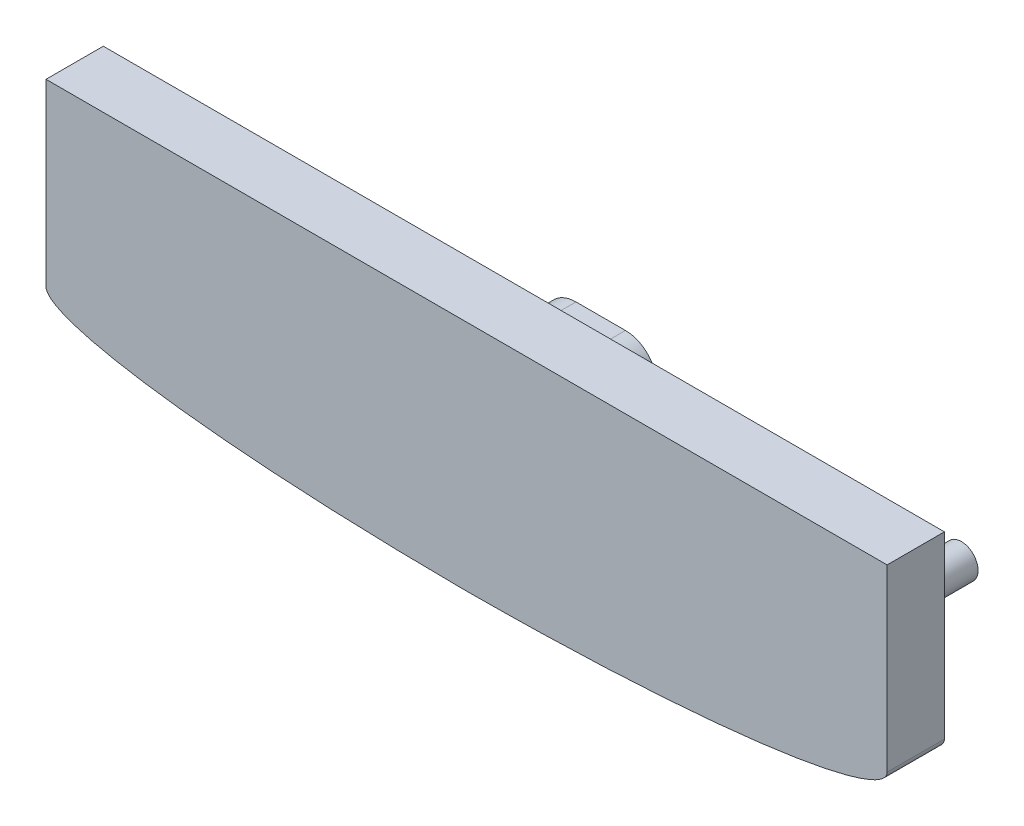
ISO-10303-21;
HEADER;
FILE_DESCRIPTION(('STEP AP214'),'2;1');
FILE_NAME('part.step','',(''),(''),'','','');
FILE_SCHEMA(('AUTOMOTIVE_DESIGN { 1 0 10303 214 1 1 1 1 }'));
ENDSEC;
DATA;
#1=APPLICATION_CONTEXT('core data for automotive mechanical design processes');
#2=APPLICATION_PROTOCOL_DEFINITION('international standard','automotive_design',2000,#1);
#3=PRODUCT_CONTEXT('',#1,'mechanical');
#4=PRODUCT('Part','Part','',(#3));
#5=PRODUCT_RELATED_PRODUCT_CATEGORY('part','',(#4));
#6=PRODUCT_DEFINITION_FORMATION('','',#4);
#7=PRODUCT_DEFINITION_CONTEXT('part definition',#1,'design');
#8=PRODUCT_DEFINITION('design','',#6,#7);
#9=PRODUCT_DEFINITION_SHAPE('','',#8);
#10=(LENGTH_UNIT() NAMED_UNIT(*) SI_UNIT(.MILLI.,.METRE.));
#11=(NAMED_UNIT(*) PLANE_ANGLE_UNIT() SI_UNIT($,.RADIAN.));
#12=(NAMED_UNIT(*) SI_UNIT($,.STERADIAN.) SOLID_ANGLE_UNIT());
#13=UNCERTAINTY_MEASURE_WITH_UNIT(LENGTH_MEASURE(1.E-05),#10,'distance_accuracy_value','');
#14=(GEOMETRIC_REPRESENTATION_CONTEXT(3) GLOBAL_UNCERTAINTY_ASSIGNED_CONTEXT((#13)) GLOBAL_UNIT_ASSIGNED_CONTEXT((#10,
#11,#12)) REPRESENTATION_CONTEXT('',''));
#15=CARTESIAN_POINT('',(0.,0.,0.));
#16=DIRECTION('',(0.,0.,1.));
#17=DIRECTION('',(1.,0.,0.));
#18=AXIS2_PLACEMENT_3D('',#15,#16,#17);
#19=CARTESIAN_POINT('',(0.,0.,-13.6271));
#20=DIRECTION('',(0.,0.,-1.));
#21=DIRECTION('',(-1.,0.,0.));
#22=AXIS2_PLACEMENT_3D('',#19,#20,#21);
#23=PLANE('',#22);
#24=CARTESIAN_POINT('',(85.7631,-22.225,-13.6271));
#25=DIRECTION('',(0.,0.,-1.));
#26=DIRECTION('',(-1.,0.,0.));
#27=AXIS2_PLACEMENT_3D('',#24,#25,#26);
#28=CIRCLE('',#27,3.96874999999999);
#29=CARTESIAN_POINT('',(81.79435,-22.225,-13.6271));
#30=VERTEX_POINT('',#29);
#31=EDGE_CURVE('E390',#30,#30,#28,.T.);
#32=ORIENTED_EDGE('',*,*,#31,.F.);
#33=EDGE_LOOP('',(#32));
#34=FACE_BOUND('',#33,.T.);
#35=CARTESIAN_POINT('',(-85.7631,-22.225,-13.6271));
#36=DIRECTION('',(0.,0.,-1.));
#37=DIRECTION('',(-1.,0.,0.));
#38=AXIS2_PLACEMENT_3D('',#35,#36,#37);
#39=CIRCLE('',#38,3.96874999999999);
#40=CARTESIAN_POINT('',(-89.73185,-22.225,-13.6271));
#41=VERTEX_POINT('',#40);
#42=EDGE_CURVE('E397',#41,#41,#39,.T.);
#43=ORIENTED_EDGE('',*,*,#42,.F.);
#44=EDGE_LOOP('',(#43));
#45=FACE_BOUND('',#44,.T.);
#46=DIRECTION('',(0.,1.,0.));
#47=VECTOR('',#46,1.);
#48=CARTESIAN_POINT('',(100.0125,0.,-13.6271));
#49=LINE('',#48,#47);
#50=CARTESIAN_POINT('',(100.0125,-42.6974,-13.6271));
#51=VERTEX_POINT('',#50);
#52=CARTESIAN_POINT('',(100.0125,0.,-13.6271));
#53=VERTEX_POINT('',#52);
#54=EDGE_CURVE('E164',#51,#53,#49,.T.);
#55=ORIENTED_EDGE('',*,*,#54,.F.);
#56=CARTESIAN_POINT('',(-1.58749999999999,-55.3974,-13.6271));
#57=CARTESIAN_POINT('',(100.0125,-55.3974,-13.6271));
#58=CARTESIAN_POINT('',(100.0125,-42.6974,-13.6271));
#59=(BOUNDED_CURVE() B_SPLINE_CURVE(2,(#56,#57,#58),.UNSPECIFIED.,.F.,
.F.) B_SPLINE_CURVE_WITH_KNOTS((3,3),(0.,1.),
.UNSPECIFIED.) CURVE() GEOMETRIC_REPRESENTATION_ITEM() RATIONAL_B_SPLINE_CURVE((1.,
0.707106781186547,1.)) REPRESENTATION_ITEM(''));
#60=CARTESIAN_POINT('',(1.58735651451836,-55.3942989384919,-13.6271));
#61=VERTEX_POINT('',#60);
#62=EDGE_CURVE('E59',#51,#61,#59,.F.);
#63=ORIENTED_EDGE('',*,*,#62,.T.);
#64=CARTESIAN_POINT('',(-1.58749999999999,-55.3974,-13.6271));
#65=CARTESIAN_POINT('',(100.0125,-55.3974,-13.6271));
#66=CARTESIAN_POINT('',(100.0125,-42.6974,-13.6271));
#67=(BOUNDED_CURVE() B_SPLINE_CURVE(2,(#64,#65,#66),.UNSPECIFIED.,.F.,
.F.) B_SPLINE_CURVE_WITH_KNOTS((3,3),(0.,1.),
.UNSPECIFIED.) CURVE() GEOMETRIC_REPRESENTATION_ITEM() RATIONAL_B_SPLINE_CURVE((1.,
0.707106781186548,1.)) REPRESENTATION_ITEM(''));
#68=CARTESIAN_POINT('',(-1.58744222363934,-55.3974,-13.6271));
#69=VERTEX_POINT('',#68);
#70=EDGE_CURVE('E291',#69,#61,#67,.T.);
#71=ORIENTED_EDGE('',*,*,#70,.F.);
#72=CARTESIAN_POINT('',(-100.0125,-42.6974,-13.6271));
#73=CARTESIAN_POINT('',(-100.0125,-55.3974,-13.6271));
#74=CARTESIAN_POINT('',(1.58750000000002,-55.3974,-13.6271));
#75=(BOUNDED_CURVE() B_SPLINE_CURVE(2,(#72,#73,#74),.UNSPECIFIED.,.F.,
.F.) B_SPLINE_CURVE_WITH_KNOTS((3,3),(0.,1.),
.UNSPECIFIED.) CURVE() GEOMETRIC_REPRESENTATION_ITEM() RATIONAL_B_SPLINE_CURVE((1.,
0.707106781186547,1.)) REPRESENTATION_ITEM(''));
#76=CARTESIAN_POINT('',(-100.0125,-42.6974,-13.6271));
#77=VERTEX_POINT('',#76);
#78=EDGE_CURVE('E66',#69,#77,#75,.F.);
#79=ORIENTED_EDGE('',*,*,#78,.T.);
#80=DIRECTION('',(0.,-1.,0.));
#81=VECTOR('',#80,1.);
#82=CARTESIAN_POINT('',(-100.0125,-55.3974,-13.6271));
#83=LINE('',#82,#81);
#84=CARTESIAN_POINT('',(-100.0125,0.,-13.6271));
#85=VERTEX_POINT('',#84);
#86=EDGE_CURVE('E182',#85,#77,#83,.T.);
#87=ORIENTED_EDGE('',*,*,#86,.F.);
#88=DIRECTION('',(-1.,0.,0.));
#89=VECTOR('',#88,1.);
#90=CARTESIAN_POINT('',(-100.0125,0.,-13.6271));
#91=LINE('',#90,#89);
#92=EDGE_CURVE('E161',#53,#85,#91,.T.);
#93=ORIENTED_EDGE('',*,*,#92,.F.);
#94=EDGE_LOOP('',(#55,#63,#71,#79,#87,#93));
#95=FACE_BOUND('',#94,.T.);
#96=DIRECTION('',(1.,0.,0.));
#97=VECTOR('',#96,1.);
#98=CARTESIAN_POINT('',(5.8801,-14.732,-13.6271));
#99=LINE('',#98,#97);
#100=CARTESIAN_POINT('',(-5.8801,-14.732,-13.6271));
#101=VERTEX_POINT('',#100);
#102=CARTESIAN_POINT('',(5.8801,-14.732,-13.6271));
#103=VERTEX_POINT('',#102);
#104=EDGE_CURVE('E409',#101,#103,#99,.T.);
#105=ORIENTED_EDGE('',*,*,#104,.F.);
#106=CARTESIAN_POINT('',(-5.8801,-22.225,-13.6271));
#107=DIRECTION('',(0.,0.,-1.));
#108=DIRECTION('',(1.,0.,0.));
#109=AXIS2_PLACEMENT_3D('',#106,#107,#108);
#110=CIRCLE('',#109,7.49299999999999);
#111=CARTESIAN_POINT('',(-5.8801,-29.718,-13.6271));
#112=VERTEX_POINT('',#111);
#113=EDGE_CURVE('E149',#112,#101,#110,.T.);
#114=ORIENTED_EDGE('',*,*,#113,.F.);
#115=DIRECTION('',(-1.,0.,0.));
#116=VECTOR('',#115,1.);
#117=CARTESIAN_POINT('',(-5.8801,-29.718,-13.6271));
#118=LINE('',#117,#116);
#119=CARTESIAN_POINT('',(5.8801,-29.718,-13.6271));
#120=VERTEX_POINT('',#119);
#121=EDGE_CURVE('E145',#120,#112,#118,.T.);
#122=ORIENTED_EDGE('',*,*,#121,.F.);
#123=CARTESIAN_POINT('',(5.8801,-22.225,-13.6271));
#124=DIRECTION('',(0.,0.,-1.));
#125=DIRECTION('',(1.,0.,0.));
#126=AXIS2_PLACEMENT_3D('',#123,#124,#125);
#127=CIRCLE('',#126,7.49299999999999);
#128=EDGE_CURVE('E411',#103,#120,#127,.T.);
#129=ORIENTED_EDGE('',*,*,#128,.F.);
#130=EDGE_LOOP('',(#105,#114,#122,#129));
#131=FACE_BOUND('',#130,.T.);
#132=ADVANCED_FACE('F43',(#34,#45,#95,#131),#23,.T.);
#133=CARTESIAN_POINT('',(100.0125,0.,-13.6271));
#134=DIRECTION('',(1.,0.,0.));
#135=DIRECTION('',(0.,1.,0.));
#136=AXIS2_PLACEMENT_3D('',#133,#134,#135);
#137=PLANE('',#136);
#138=DIRECTION('',(0.,1.,0.));
#139=VECTOR('',#138,1.);
#140=CARTESIAN_POINT('',(100.0125,0.,0.));
#141=LINE('',#140,#139);
#142=CARTESIAN_POINT('',(100.0125,-42.6974,0.));
#143=VERTEX_POINT('',#142);
#144=CARTESIAN_POINT('',(100.0125,0.,0.));
#145=VERTEX_POINT('',#144);
#146=EDGE_CURVE('E151',#143,#145,#141,.T.);
#147=ORIENTED_EDGE('',*,*,#146,.F.);
#148=CARTESIAN_POINT('',(100.0125,-42.6974,-14.308455));
#149=CARTESIAN_POINT('',(100.0125,-42.6974,-9.31185166666667));
#150=CARTESIAN_POINT('',(100.0125,-42.6974,-4.31524833333333));
#151=CARTESIAN_POINT('',(100.0125,-42.6974,0.681354999999998));
#152=(BOUNDED_CURVE() B_SPLINE_CURVE(3,(#148,#149,#150,#151),.UNSPECIFIED.,.F.,
.F.) B_SPLINE_CURVE_WITH_KNOTS((4,4),(-0.000681355,0.014308455),
.UNSPECIFIED.) CURVE() GEOMETRIC_REPRESENTATION_ITEM() RATIONAL_B_SPLINE_CURVE((1.,1.,1.,1.)) REPRESENTATION_ITEM(''));
#153=EDGE_CURVE('E176',#143,#51,#152,.F.);
#154=ORIENTED_EDGE('',*,*,#153,.T.);
#155=ORIENTED_EDGE('',*,*,#54,.T.);
#156=DIRECTION('',(0.,0.,1.));
#157=VECTOR('',#156,1.);
#158=CARTESIAN_POINT('',(100.0125,0.,-13.6271));
#159=LINE('',#158,#157);
#160=EDGE_CURVE('E341',#53,#145,#159,.T.);
#161=ORIENTED_EDGE('',*,*,#160,.T.);
#162=EDGE_LOOP('',(#147,#154,#155,#161));
#163=FACE_BOUND('',#162,.T.);
#164=ADVANCED_FACE('F183',(#163),#137,.T.);
#165=CARTESIAN_POINT('',(-100.0125,-55.3974,-13.6271));
#166=DIRECTION('',(-1.,0.,0.));
#167=DIRECTION('',(0.,0.,1.));
#168=AXIS2_PLACEMENT_3D('',#165,#166,#167);
#169=PLANE('',#168);
#170=ORIENTED_EDGE('',*,*,#86,.T.);
#171=CARTESIAN_POINT('',(-100.0125,-42.6974,0.681354999999998));
#172=CARTESIAN_POINT('',(-100.0125,-42.6974,-4.31524833333333));
#173=CARTESIAN_POINT('',(-100.0125,-42.6974,-9.31185166666667));
#174=CARTESIAN_POINT('',(-100.0125,-42.6974,-14.308455));
#175=(BOUNDED_CURVE() B_SPLINE_CURVE(3,(#171,#172,#173,#174),.UNSPECIFIED.,.F.,
.F.) B_SPLINE_CURVE_WITH_KNOTS((4,4),(-0.000681355,0.014308455),
.UNSPECIFIED.) CURVE() GEOMETRIC_REPRESENTATION_ITEM() RATIONAL_B_SPLINE_CURVE((1.,1.,1.,1.)) REPRESENTATION_ITEM(''));
#176=CARTESIAN_POINT('',(-100.0125,-42.6974,0.));
#177=VERTEX_POINT('',#176);
#178=EDGE_CURVE('E12',#77,#177,#175,.F.);
#179=ORIENTED_EDGE('',*,*,#178,.T.);
#180=DIRECTION('',(0.,-1.,0.));
#181=VECTOR('',#180,1.);
#182=CARTESIAN_POINT('',(-100.0125,-55.3974,0.));
#183=LINE('',#182,#181);
#184=CARTESIAN_POINT('',(-100.0125,0.,0.));
#185=VERTEX_POINT('',#184);
#186=EDGE_CURVE('E349',#185,#177,#183,.T.);
#187=ORIENTED_EDGE('',*,*,#186,.F.);
#188=DIRECTION('',(0.,0.,1.));
#189=VECTOR('',#188,1.);
#190=CARTESIAN_POINT('',(-100.0125,0.,-13.6271));
#191=LINE('',#190,#189);
#192=EDGE_CURVE('E338',#85,#185,#191,.T.);
#193=ORIENTED_EDGE('',*,*,#192,.F.);
#194=EDGE_LOOP('',(#170,#179,#187,#193));
#195=FACE_BOUND('',#194,.T.);
#196=ADVANCED_FACE('F192',(#195),#169,.T.);
#197=CARTESIAN_POINT('',(-100.0125,0.,-13.6271));
#198=DIRECTION('',(0.,1.,0.));
#199=DIRECTION('',(-1.,0.,0.));
#200=AXIS2_PLACEMENT_3D('',#197,#198,#199);
#201=PLANE('',#200);
#202=DIRECTION('',(-1.,0.,0.));
#203=VECTOR('',#202,1.);
#204=CARTESIAN_POINT('',(-100.0125,0.,0.));
#205=LINE('',#204,#203);
#206=EDGE_CURVE('E153',#145,#185,#205,.T.);
#207=ORIENTED_EDGE('',*,*,#206,.F.);
#208=ORIENTED_EDGE('',*,*,#160,.F.);
#209=ORIENTED_EDGE('',*,*,#92,.T.);
#210=ORIENTED_EDGE('',*,*,#192,.T.);
#211=EDGE_LOOP('',(#207,#208,#209,#210));
#212=FACE_BOUND('',#211,.T.);
#213=ADVANCED_FACE('F193',(#212),#201,.T.);
#214=CARTESIAN_POINT('',(0.,0.,0.));
#215=DIRECTION('',(0.,0.,-1.));
#216=DIRECTION('',(-1.,0.,0.));
#217=AXIS2_PLACEMENT_3D('',#214,#215,#216);
#218=PLANE('',#217);
#219=CARTESIAN_POINT('',(100.0125,-42.6974,0.));
#220=CARTESIAN_POINT('',(100.0125,-55.3974,0.));
#221=CARTESIAN_POINT('',(-1.58749999999999,-55.3974,0.));
#222=(BOUNDED_CURVE() B_SPLINE_CURVE(2,(#219,#220,#221),.UNSPECIFIED.,.F.,
.F.) B_SPLINE_CURVE_WITH_KNOTS((3,3),(0.,1.),
.UNSPECIFIED.) CURVE() GEOMETRIC_REPRESENTATION_ITEM() RATIONAL_B_SPLINE_CURVE((1.,
0.707106781186547,1.)) REPRESENTATION_ITEM(''));
#223=CARTESIAN_POINT('',(-1.58742861616346,-55.3974,0.));
#224=VERTEX_POINT('',#223);
#225=CARTESIAN_POINT('',(1.58738373006105,-55.3942988853116,0.));
#226=VERTEX_POINT('',#225);
#227=EDGE_CURVE('E167',#224,#226,#222,.F.);
#228=ORIENTED_EDGE('',*,*,#227,.T.);
#229=CARTESIAN_POINT('',(100.0125,-42.6974,0.));
#230=CARTESIAN_POINT('',(100.0125,-55.3974,0.));
#231=CARTESIAN_POINT('',(-1.58749999999999,-55.3974,0.));
#232=(BOUNDED_CURVE() B_SPLINE_CURVE(2,(#229,#230,#231),.UNSPECIFIED.,.F.,
.F.) B_SPLINE_CURVE_WITH_KNOTS((3,3),(0.,1.),
.UNSPECIFIED.) CURVE() GEOMETRIC_REPRESENTATION_ITEM() RATIONAL_B_SPLINE_CURVE((1.,
0.707106781186547,1.)) REPRESENTATION_ITEM(''));
#233=EDGE_CURVE('E366',#226,#143,#232,.F.);
#234=ORIENTED_EDGE('',*,*,#233,.T.);
#235=ORIENTED_EDGE('',*,*,#146,.T.);
#236=ORIENTED_EDGE('',*,*,#206,.T.);
#237=ORIENTED_EDGE('',*,*,#186,.T.);
#238=CARTESIAN_POINT('',(1.58750000000002,-55.3974,0.));
#239=CARTESIAN_POINT('',(-100.0125,-55.3974,0.));
#240=CARTESIAN_POINT('',(-100.0125,-42.6974,0.));
#241=(BOUNDED_CURVE() B_SPLINE_CURVE(2,(#238,#239,#240),.UNSPECIFIED.,.F.,
.F.) B_SPLINE_CURVE_WITH_KNOTS((3,3),(0.,1.),
.UNSPECIFIED.) CURVE() GEOMETRIC_REPRESENTATION_ITEM() RATIONAL_B_SPLINE_CURVE((1.,
0.707106781186547,1.)) REPRESENTATION_ITEM(''));
#242=EDGE_CURVE('E260',#177,#224,#241,.F.);
#243=ORIENTED_EDGE('',*,*,#242,.T.);
#244=EDGE_LOOP('',(#228,#234,#235,#236,#237,#243));
#245=FACE_BOUND('',#244,.T.);
#246=ADVANCED_FACE('F305',(#245),#218,.F.);
#247=CARTESIAN_POINT('',(-5.8801,-22.225,-31.9024));
#248=DIRECTION('',(0.,0.,1.));
#249=DIRECTION('',(1.,0.,0.));
#250=AXIS2_PLACEMENT_3D('',#247,#248,#249);
#251=CYLINDRICAL_SURFACE('',#250,7.49299999999999);
#252=ORIENTED_EDGE('',*,*,#113,.T.);
#253=DIRECTION('',(0.,0.,1.));
#254=VECTOR('',#253,1.);
#255=CARTESIAN_POINT('',(-5.8801,-14.732,-31.9024));
#256=LINE('',#255,#254);
#257=CARTESIAN_POINT('',(-5.8801,-14.732,-31.9024));
#258=VERTEX_POINT('',#257);
#259=EDGE_CURVE('E129',#258,#101,#256,.T.);
#260=ORIENTED_EDGE('',*,*,#259,.F.);
#261=CARTESIAN_POINT('',(-5.8801,-22.225,-31.9024));
#262=DIRECTION('',(0.,0.,-1.));
#263=DIRECTION('',(1.,0.,0.));
#264=AXIS2_PLACEMENT_3D('',#261,#262,#263);
#265=CIRCLE('',#264,7.49299999999999);
#266=CARTESIAN_POINT('',(-5.8801,-29.718,-31.9024));
#267=VERTEX_POINT('',#266);
#268=EDGE_CURVE('E136',#267,#258,#265,.T.);
#269=ORIENTED_EDGE('',*,*,#268,.F.);
#270=DIRECTION('',(0.,0.,1.));
#271=VECTOR('',#270,1.);
#272=CARTESIAN_POINT('',(-5.8801,-29.718,-31.9024));
#273=LINE('',#272,#271);
#274=EDGE_CURVE('E407',#267,#112,#273,.T.);
#275=ORIENTED_EDGE('',*,*,#274,.T.);
#276=EDGE_LOOP('',(#252,#260,#269,#275));
#277=FACE_BOUND('',#276,.T.);
#278=ADVANCED_FACE('F147',(#277),#251,.T.);
#279=CARTESIAN_POINT('',(5.8801,-14.732,-31.9024));
#280=DIRECTION('',(0.,-1.,0.));
#281=DIRECTION('',(0.,0.,-1.));
#282=AXIS2_PLACEMENT_3D('',#279,#280,#281);
#283=PLANE('',#282);
#284=ORIENTED_EDGE('',*,*,#104,.T.);
#285=DIRECTION('',(0.,0.,1.));
#286=VECTOR('',#285,1.);
#287=CARTESIAN_POINT('',(5.8801,-14.732,-31.9024));
#288=LINE('',#287,#286);
#289=CARTESIAN_POINT('',(5.8801,-14.732,-31.9024));
#290=VERTEX_POINT('',#289);
#291=EDGE_CURVE('E132',#290,#103,#288,.T.);
#292=ORIENTED_EDGE('',*,*,#291,.F.);
#293=DIRECTION('',(1.,0.,0.));
#294=VECTOR('',#293,1.);
#295=CARTESIAN_POINT('',(5.8801,-14.732,-31.9024));
#296=LINE('',#295,#294);
#297=EDGE_CURVE('E125',#258,#290,#296,.T.);
#298=ORIENTED_EDGE('',*,*,#297,.F.);
#299=ORIENTED_EDGE('',*,*,#259,.T.);
#300=EDGE_LOOP('',(#284,#292,#298,#299));
#301=FACE_BOUND('',#300,.T.);
#302=ADVANCED_FACE('F127',(#301),#283,.F.);
#303=CARTESIAN_POINT('',(5.8801,-22.225,-31.9024));
#304=DIRECTION('',(0.,0.,1.));
#305=DIRECTION('',(1.,0.,0.));
#306=AXIS2_PLACEMENT_3D('',#303,#304,#305);
#307=CYLINDRICAL_SURFACE('',#306,7.49299999999999);
#308=ORIENTED_EDGE('',*,*,#128,.T.);
#309=DIRECTION('',(0.,0.,1.));
#310=VECTOR('',#309,1.);
#311=CARTESIAN_POINT('',(5.8801,-29.718,-31.9024));
#312=LINE('',#311,#310);
#313=CARTESIAN_POINT('',(5.8801,-29.718,-31.9024));
#314=VERTEX_POINT('',#313);
#315=EDGE_CURVE('E155',#314,#120,#312,.T.);
#316=ORIENTED_EDGE('',*,*,#315,.F.);
#317=CARTESIAN_POINT('',(5.8801,-22.225,-31.9024));
#318=DIRECTION('',(0.,0.,-1.));
#319=DIRECTION('',(1.,0.,0.));
#320=AXIS2_PLACEMENT_3D('',#317,#318,#319);
#321=CIRCLE('',#320,7.49299999999999);
#322=EDGE_CURVE('E135',#290,#314,#321,.T.);
#323=ORIENTED_EDGE('',*,*,#322,.F.);
#324=ORIENTED_EDGE('',*,*,#291,.T.);
#325=EDGE_LOOP('',(#308,#316,#323,#324));
#326=FACE_BOUND('',#325,.T.);
#327=ADVANCED_FACE('F421',(#326),#307,.T.);
#328=CARTESIAN_POINT('',(-5.8801,-29.718,-31.9024));
#329=DIRECTION('',(0.,1.,0.));
#330=DIRECTION('',(0.,0.,1.));
#331=AXIS2_PLACEMENT_3D('',#328,#329,#330);
#332=PLANE('',#331);
#333=ORIENTED_EDGE('',*,*,#121,.T.);
#334=ORIENTED_EDGE('',*,*,#274,.F.);
#335=DIRECTION('',(-1.,0.,0.));
#336=VECTOR('',#335,1.);
#337=CARTESIAN_POINT('',(-5.8801,-29.718,-31.9024));
#338=LINE('',#337,#336);
#339=EDGE_CURVE('E141',#314,#267,#338,.T.);
#340=ORIENTED_EDGE('',*,*,#339,.F.);
#341=ORIENTED_EDGE('',*,*,#315,.T.);
#342=EDGE_LOOP('',(#333,#334,#340,#341));
#343=FACE_BOUND('',#342,.T.);
#344=ADVANCED_FACE('F417',(#343),#332,.F.);
#345=CARTESIAN_POINT('',(-5.8801,-22.225,-31.9024));
#346=DIRECTION('',(0.,0.,1.));
#347=DIRECTION('',(1.,0.,0.));
#348=AXIS2_PLACEMENT_3D('',#345,#346,#347);
#349=PLANE('',#348);
#350=ORIENTED_EDGE('',*,*,#268,.T.);
#351=ORIENTED_EDGE('',*,*,#297,.T.);
#352=ORIENTED_EDGE('',*,*,#322,.T.);
#353=ORIENTED_EDGE('',*,*,#339,.T.);
#354=EDGE_LOOP('',(#350,#351,#352,#353));
#355=FACE_BOUND('',#354,.T.);
#356=ADVANCED_FACE('F139',(#355),#349,.F.);
#357=CARTESIAN_POINT('',(-85.7631,-22.225,-31.9024));
#358=DIRECTION('',(0.,0.,1.));
#359=DIRECTION('',(1.,0.,0.));
#360=AXIS2_PLACEMENT_3D('',#357,#358,#359);
#361=CYLINDRICAL_SURFACE('',#360,3.96874999999999);
#362=CARTESIAN_POINT('',(-85.7631,-22.225,-31.9024));
#363=DIRECTION('',(0.,0.,-1.));
#364=DIRECTION('',(-1.,0.,0.));
#365=AXIS2_PLACEMENT_3D('',#362,#363,#364);
#366=CIRCLE('',#365,3.96874999999999);
#367=CARTESIAN_POINT('',(-89.73185,-22.225,-31.9024));
#368=VERTEX_POINT('',#367);
#369=EDGE_CURVE('E400',#368,#368,#366,.T.);
#370=ORIENTED_EDGE('',*,*,#369,.F.);
#371=EDGE_LOOP('',(#370));
#372=FACE_BOUND('',#371,.T.);
#373=ORIENTED_EDGE('',*,*,#42,.T.);
#374=EDGE_LOOP('',(#373));
#375=FACE_BOUND('',#374,.T.);
#376=ADVANCED_FACE('F432',(#372,#375),#361,.T.);
#377=CARTESIAN_POINT('',(-85.7631,-22.225,-31.9024));
#378=DIRECTION('',(0.,0.,-1.));
#379=DIRECTION('',(-1.,0.,0.));
#380=AXIS2_PLACEMENT_3D('',#377,#378,#379);
#381=PLANE('',#380);
#382=ORIENTED_EDGE('',*,*,#369,.T.);
#383=EDGE_LOOP('',(#382));
#384=FACE_BOUND('',#383,.T.);
#385=ADVANCED_FACE('F435',(#384),#381,.T.);
#386=CARTESIAN_POINT('',(85.7631,-22.225,-31.9024));
#387=DIRECTION('',(0.,0.,1.));
#388=DIRECTION('',(1.,0.,0.));
#389=AXIS2_PLACEMENT_3D('',#386,#387,#388);
#390=CYLINDRICAL_SURFACE('',#389,3.96874999999999);
#391=CARTESIAN_POINT('',(85.7631,-22.225,-31.9024));
#392=DIRECTION('',(0.,0.,-1.));
#393=DIRECTION('',(-1.,0.,0.));
#394=AXIS2_PLACEMENT_3D('',#391,#392,#393);
#395=CIRCLE('',#394,3.96874999999999);
#396=CARTESIAN_POINT('',(81.79435,-22.225,-31.9024));
#397=VERTEX_POINT('',#396);
#398=EDGE_CURVE('E392',#397,#397,#395,.T.);
#399=ORIENTED_EDGE('',*,*,#398,.F.);
#400=EDGE_LOOP('',(#399));
#401=FACE_BOUND('',#400,.T.);
#402=ORIENTED_EDGE('',*,*,#31,.T.);
#403=EDGE_LOOP('',(#402));
#404=FACE_BOUND('',#403,.T.);
#405=ADVANCED_FACE('F439',(#401,#404),#390,.T.);
#406=CARTESIAN_POINT('',(85.7631,-22.225,-31.9024));
#407=DIRECTION('',(0.,0.,-1.));
#408=DIRECTION('',(-1.,0.,0.));
#409=AXIS2_PLACEMENT_3D('',#406,#407,#408);
#410=PLANE('',#409);
#411=ORIENTED_EDGE('',*,*,#398,.T.);
#412=EDGE_LOOP('',(#411));
#413=FACE_BOUND('',#412,.T.);
#414=ADVANCED_FACE('F443',(#413),#410,.T.);
#415=CARTESIAN_POINT('',(-100.0125,-42.6974,-14.308455));
#416=CARTESIAN_POINT('',(-100.0125,-42.6974,-9.31185166666667));
#417=CARTESIAN_POINT('',(-100.0125,-42.6974,-4.31524833333333));
#418=CARTESIAN_POINT('',(-100.0125,-42.6974,0.681354999999998));
#419=CARTESIAN_POINT('',(-100.0125,-55.3974,-14.308455));
#420=CARTESIAN_POINT('',(-100.0125,-55.3974,-9.31185166666666));
#421=CARTESIAN_POINT('',(-100.0125,-55.3974,-4.31524833333334));
#422=CARTESIAN_POINT('',(-100.0125,-55.3974,0.681354999999998));
#423=CARTESIAN_POINT('',(1.58750000000002,-55.3974,-14.308455));
#424=CARTESIAN_POINT('',(1.58750000000002,-55.3974,-9.31185166666667));
#425=CARTESIAN_POINT('',(1.58750000000002,-55.3974,-4.31524833333333));
#426=CARTESIAN_POINT('',(1.58750000000002,-55.3974,0.681354999999998));
#427=(BOUNDED_SURFACE() B_SPLINE_SURFACE(2,3,((#415,#416,#417,#418),(#419,#420,#421,#422),(#423,
#424,#425,#426)),.UNSPECIFIED.,.F.,.F.,.F.) B_SPLINE_SURFACE_WITH_KNOTS((3,3),(4,4),(0.,1.),
(-0.000681355,0.014308455),
.UNSPECIFIED.) GEOMETRIC_REPRESENTATION_ITEM() RATIONAL_B_SPLINE_SURFACE(((1.,1.,1.,1.),
(0.707106781186547,0.707106781186547,0.707106781186547,0.707106781186547),(1.,1.,1.,1.))) REPRESENTATION_ITEM('') SURFACE());
#428=CARTESIAN_POINT('',(1.38686995128302E-12,-55.3958496123973,-6.81355));
#429=CARTESIAN_POINT('',(-0.0663504769365739,-55.3959792190106,-7.09744227108231));
#430=CARTESIAN_POINT('',(-0.132676948890416,-55.3961006512443,-7.38134015633073));
#431=CARTESIAN_POINT('',(-0.265278932496503,-55.3963271987277,-7.94913592727793));
#432=CARTESIAN_POINT('',(-0.331554446070621,-55.3964323146261,-8.23303381252762));
#433=CARTESIAN_POINT('',(-0.464054190886019,-55.3966262676387,-8.80082958358906));
#434=CARTESIAN_POINT('',(-0.530278424072185,-55.3967151054037,-9.08472746894674));
#435=CARTESIAN_POINT('',(-0.662675288185031,-55.3968765404703,-9.65252324020003));
#436=CARTESIAN_POINT('',(-0.728847921079577,-55.3969491384246,-9.9364211256366));
#437=CARTESIAN_POINT('',(-0.861141266279198,-55.3970781322781,-10.5042168970623));
#438=CARTESIAN_POINT('',(-0.927261980575105,-55.397134528832,-10.7881147825875));
#439=CARTESIAN_POINT('',(-1.05945117201386,-55.3972311583899,-11.3559105541857));
#440=CARTESIAN_POINT('',(-1.12551965117047,-55.3972713920506,-11.6398084397897));
#441=CARTESIAN_POINT('',(-1.25760405736401,-55.3973357344129,-12.2076042115797));
#442=CARTESIAN_POINT('',(-1.32361998643763,-55.3973598437731,-12.4915020972917));
#443=CARTESIAN_POINT('',(-1.45559897960471,-55.3973919762394,-13.0592978691959));
#444=CARTESIAN_POINT('',(-1.52156204575775,-55.3974000000059,-13.3431957549091));
#445=CARTESIAN_POINT('',(-1.58749988387289,-55.3974,-13.6270995));
#446=B_SPLINE_CURVE_WITH_KNOTS('',3,(#428,#429,#430,#431,#432,#433,#434,#435,#436,#437,#438,
#439,#440,#441,#442,#443,#444,#445),.UNSPECIFIED.,.F.,.F.,(4,2,2,2,2,2,2,2,4),(0.,
0.874628501500258,1.74922221733707,2.62378095638487,3.49830452914934,4.37279274776733,
5.24724542600658,6.12166237926547,6.99604342457263),.UNSPECIFIED.);
#447=CARTESIAN_POINT('',(-3.92294060816546E-13,-55.3958496123973,-6.81355));
#448=VERTEX_POINT('',#447);
#449=EDGE_CURVE('E370',#448,#69,#446,.T.);
#450=CARTESIAN_POINT('',(-1.5875,-55.3974,0.));
#451=CARTESIAN_POINT('',(-1.52156215707731,-55.3974000000153,-0.283903765925068));
#452=CARTESIAN_POINT('',(-1.45559908611294,-55.397391976257,-0.567801672471693));
#453=CARTESIAN_POINT('',(-1.32362008331528,-55.397359843805,-1.13559748604246));
#454=CARTESIAN_POINT('',(-1.25760414942241,-55.3973357344506,-1.41949539258784));
#455=CARTESIAN_POINT('',(-1.12551973358252,-55.3972713920979,-1.98729120604447));
#456=CARTESIAN_POINT('',(-1.0594512495988,-55.3972311584407,-2.27118911248185));
#457=CARTESIAN_POINT('',(-0.927262048498067,-55.3971345288876,-2.83898492574668));
#458=CARTESIAN_POINT('',(-0.861141329367277,-55.3970781323349,-3.12288283210518));
#459=CARTESIAN_POINT('',(-0.728847974490177,-55.3969491384814,-3.69067864519758));
#460=CARTESIAN_POINT('',(-0.662675336753034,-55.3968765405259,-3.97457655146748));
#461=CARTESIAN_POINT('',(-0.530278462947352,-55.3967151054547,-4.54237236438744));
#462=CARTESIAN_POINT('',(-0.464054224910946,-55.3966262676861,-4.82627027057845));
#463=CARTESIAN_POINT('',(-0.331554470387496,-55.396432314664,-5.39406608330655));
#464=CARTESIAN_POINT('',(-0.265278951955564,-55.3963271987598,-5.67796398938957));
#465=CARTESIAN_POINT('',(-0.13267695862635,-55.3961006512622,-6.24575980200343));
#466=CARTESIAN_POINT('',(-0.0663504818071923,-55.3959792190201,-6.52965770808518));
#467=CARTESIAN_POINT('',(-3.91946252164326E-13,-55.3958496123973,-6.81355));
#468=B_SPLINE_CURVE_WITH_KNOTS('',3,(#450,#451,#452,#453,#454,#455,#456,#457,#458,#459,#460,
#461,#462,#463,#464,#465,#466,#467),.UNSPECIFIED.,.F.,.F.,(4,2,2,2,2,2,2,2,4),(0.,
0.87438110945216,1.74879812686142,2.62325086925637,3.49773915203533,4.37226278896602,
5.24682159218525,6.12141537219865,6.99604393788061),.UNSPECIFIED.);
#469=EDGE_CURVE('E369',#224,#448,#468,.T.);
#470=ORIENTED_EDGE('',*,*,#178,.F.);
#471=ORIENTED_EDGE('',*,*,#78,.F.);
#472=ORIENTED_EDGE('',*,*,#449,.F.);
#473=ORIENTED_EDGE('',*,*,#469,.F.);
#474=ORIENTED_EDGE('',*,*,#242,.F.);
#475=EDGE_LOOP('',(#470,#471,#472,#473,#474));
#476=FACE_BOUND('',#475,.T.);
#477=ADVANCED_FACE('F46',(#476),#427,.T.);
#478=CARTESIAN_POINT('',(-1.58749999999999,-55.3974,-14.308455));
#479=CARTESIAN_POINT('',(-1.58749999999999,-55.3974,-9.31185166666667));
#480=CARTESIAN_POINT('',(-1.58749999999999,-55.3974,-4.31524833333333));
#481=CARTESIAN_POINT('',(-1.58749999999999,-55.3974,0.681354999999998));
#482=CARTESIAN_POINT('',(100.0125,-55.3974,-14.308455));
#483=CARTESIAN_POINT('',(100.0125,-55.3974,-9.31185166666666));
#484=CARTESIAN_POINT('',(100.0125,-55.3974,-4.31524833333334));
#485=CARTESIAN_POINT('',(100.0125,-55.3974,0.681354999999998));
#486=CARTESIAN_POINT('',(100.0125,-42.6974,-14.308455));
#487=CARTESIAN_POINT('',(100.0125,-42.6974,-9.31185166666667));
#488=CARTESIAN_POINT('',(100.0125,-42.6974,-4.31524833333333));
#489=CARTESIAN_POINT('',(100.0125,-42.6974,0.681354999999998));
#490=(BOUNDED_SURFACE() B_SPLINE_SURFACE(2,3,((#478,#479,#480,#481),(#482,#483,#484,#485),(#486,
#487,#488,#489)),.UNSPECIFIED.,.F.,.F.,.F.) B_SPLINE_SURFACE_WITH_KNOTS((3,3),(4,4),(0.,1.),
(-0.000681355,0.014308455),
.UNSPECIFIED.) GEOMETRIC_REPRESENTATION_ITEM() RATIONAL_B_SPLINE_SURFACE(((1.,1.,1.,1.),
(0.707106781186547,0.707106781186547,0.707106781186547,0.707106781186547),(1.,1.,1.,1.))) REPRESENTATION_ITEM('') SURFACE());
#491=ORIENTED_EDGE('',*,*,#62,.F.);
#492=ORIENTED_EDGE('',*,*,#153,.F.);
#493=ORIENTED_EDGE('',*,*,#233,.F.);
#494=ORIENTED_EDGE('',*,*,#227,.F.);
#495=ORIENTED_EDGE('',*,*,#469,.T.);
#496=ORIENTED_EDGE('',*,*,#449,.T.);
#497=ORIENTED_EDGE('',*,*,#70,.T.);
#498=EDGE_LOOP('',(#491,#492,#493,#494,#495,#496,#497));
#499=FACE_BOUND('',#498,.T.);
#500=ADVANCED_FACE('F196',(#499),#490,.T.);
#501=CLOSED_SHELL('',(#132,#164,#196,#213,#246,#278,#302,#327,#344,#356,#376,#385,#405,#414,
#477,#500));
#502=MANIFOLD_SOLID_BREP('B2',#501);
#503=ADVANCED_BREP_SHAPE_REPRESENTATION('',(#18,#502),#14);
#504=SHAPE_DEFINITION_REPRESENTATION(#9,#503);
ENDSEC;
END-ISO-10303-21;
